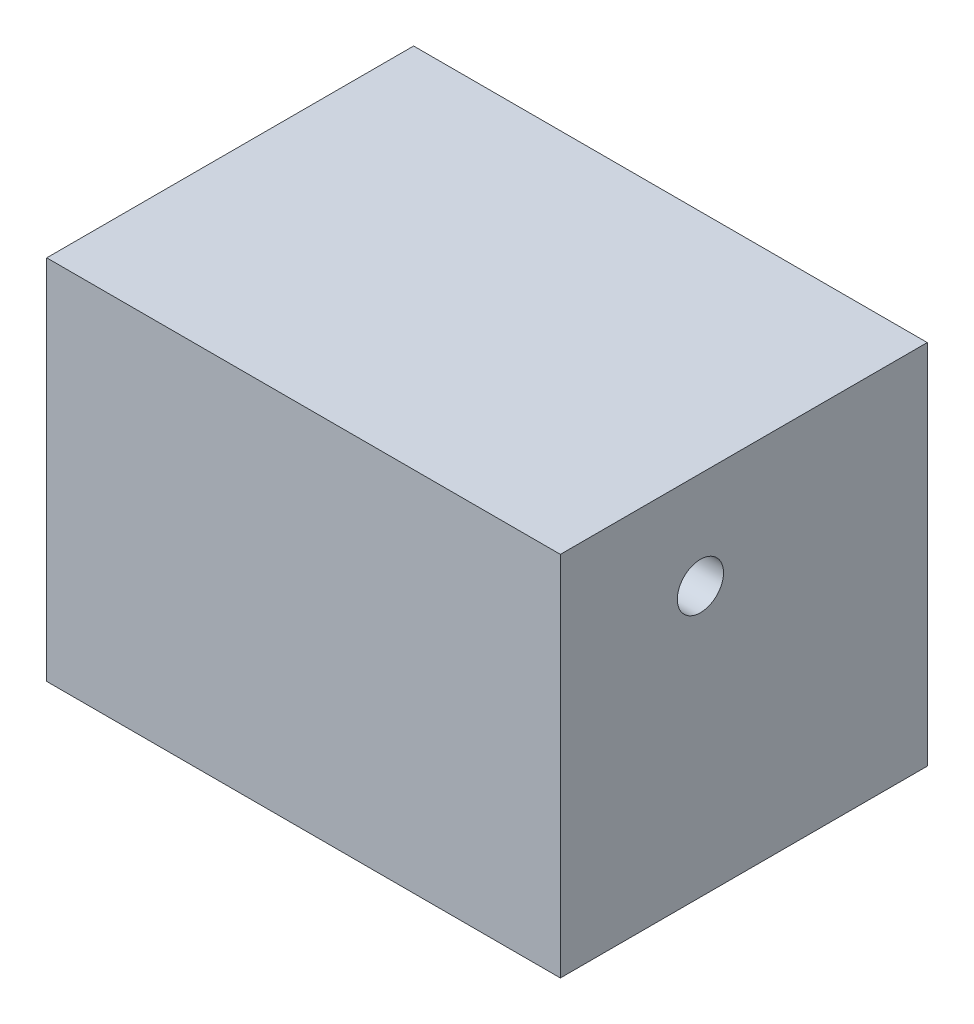
ISO-10303-21;
HEADER;
FILE_DESCRIPTION(('STEP AP214'),'2;1');
FILE_NAME('part.step','',(''),(''),'','','');
FILE_SCHEMA(('AUTOMOTIVE_DESIGN { 1 0 10303 214 1 1 1 1 }'));
ENDSEC;
DATA;
#1=APPLICATION_CONTEXT('core data for automotive mechanical design processes');
#2=APPLICATION_PROTOCOL_DEFINITION('international standard','automotive_design',2000,#1);
#3=PRODUCT_CONTEXT('',#1,'mechanical');
#4=PRODUCT('Part','Part','',(#3));
#5=PRODUCT_RELATED_PRODUCT_CATEGORY('part','',(#4));
#6=PRODUCT_DEFINITION_FORMATION('','',#4);
#7=PRODUCT_DEFINITION_CONTEXT('part definition',#1,'design');
#8=PRODUCT_DEFINITION('design','',#6,#7);
#9=PRODUCT_DEFINITION_SHAPE('','',#8);
#10=(LENGTH_UNIT() NAMED_UNIT(*) SI_UNIT(.MILLI.,.METRE.));
#11=(NAMED_UNIT(*) PLANE_ANGLE_UNIT() SI_UNIT($,.RADIAN.));
#12=(NAMED_UNIT(*) SI_UNIT($,.STERADIAN.) SOLID_ANGLE_UNIT());
#13=UNCERTAINTY_MEASURE_WITH_UNIT(LENGTH_MEASURE(1.E-05),#10,'distance_accuracy_value','');
#14=(GEOMETRIC_REPRESENTATION_CONTEXT(3) GLOBAL_UNCERTAINTY_ASSIGNED_CONTEXT((#13)) GLOBAL_UNIT_ASSIGNED_CONTEXT((#10,
#11,#12)) REPRESENTATION_CONTEXT('',''));
#15=CARTESIAN_POINT('',(0.,0.,0.));
#16=DIRECTION('',(0.,0.,1.));
#17=DIRECTION('',(1.,0.,0.));
#18=AXIS2_PLACEMENT_3D('',#15,#16,#17);
#19=CARTESIAN_POINT('',(22.5916230366492,16.3350785340314,45.));
#20=DIRECTION('',(1.,0.,0.));
#21=DIRECTION('',(0.,1.,0.));
#22=AXIS2_PLACEMENT_3D('',#19,#20,#21);
#23=PLANE('',#22);
#24=CARTESIAN_POINT('',(22.5916230366492,8.05660679893094,30.9132628317386));
#25=DIRECTION('',(1.,0.,0.));
#26=DIRECTION('',(0.,1.,0.));
#27=AXIS2_PLACEMENT_3D('',#24,#25,#26);
#28=CIRCLE('',#27,3.14974379424633);
#29=CARTESIAN_POINT('',(22.5916230366492,11.2063505931773,30.9132628317386));
#30=VERTEX_POINT('',#29);
#31=EDGE_CURVE('E244',#30,#30,#28,.F.);
#32=ORIENTED_EDGE('',*,*,#31,.F.);
#33=EDGE_LOOP('',(#32));
#34=FACE_BOUND('',#33,.T.);
#35=DIRECTION('',(0.,-1.,0.));
#36=VECTOR('',#35,1.);
#37=CARTESIAN_POINT('',(22.5916230366492,16.3350785340314,5.));
#38=LINE('',#37,#36);
#39=CARTESIAN_POINT('',(22.5916230366492,16.3350785340314,5.));
#40=VERTEX_POINT('',#39);
#41=CARTESIAN_POINT('',(22.5916230366492,-23.6649214659686,5.));
#42=VERTEX_POINT('',#41);
#43=EDGE_CURVE('E115',#40,#42,#38,.T.);
#44=ORIENTED_EDGE('',*,*,#43,.T.);
#45=DIRECTION('',(0.,0.,-1.));
#46=VECTOR('',#45,1.);
#47=CARTESIAN_POINT('',(22.5916230366492,-23.6649214659686,45.));
#48=LINE('',#47,#46);
#49=CARTESIAN_POINT('',(22.5916230366492,-23.6649214659686,45.));
#50=VERTEX_POINT('',#49);
#51=EDGE_CURVE('E109',#50,#42,#48,.T.);
#52=ORIENTED_EDGE('',*,*,#51,.F.);
#53=DIRECTION('',(0.,-1.,0.));
#54=VECTOR('',#53,1.);
#55=CARTESIAN_POINT('',(22.5916230366492,16.3350785340314,45.));
#56=LINE('',#55,#54);
#57=CARTESIAN_POINT('',(22.5916230366492,16.3350785340314,45.));
#58=VERTEX_POINT('',#57);
#59=EDGE_CURVE('E112',#58,#50,#56,.T.);
#60=ORIENTED_EDGE('',*,*,#59,.F.);
#61=DIRECTION('',(0.,0.,-1.));
#62=VECTOR('',#61,1.);
#63=CARTESIAN_POINT('',(22.5916230366492,16.3350785340314,45.));
#64=LINE('',#63,#62);
#65=EDGE_CURVE('E148',#58,#40,#64,.T.);
#66=ORIENTED_EDGE('',*,*,#65,.T.);
#67=EDGE_LOOP('',(#44,#52,#60,#66));
#68=FACE_BOUND('',#67,.T.);
#69=ADVANCED_FACE('F34',(#34,#68),#23,.F.);
#70=CARTESIAN_POINT('',(22.5916230366492,16.3350785340314,45.));
#71=DIRECTION('',(0.,1.,0.));
#72=DIRECTION('',(0.,0.,1.));
#73=AXIS2_PLACEMENT_3D('',#70,#71,#72);
#74=PLANE('',#73);
#75=DIRECTION('',(1.,0.,0.));
#76=VECTOR('',#75,1.);
#77=CARTESIAN_POINT('',(22.5916230366492,16.3350785340314,5.));
#78=LINE('',#77,#76);
#79=CARTESIAN_POINT('',(-37.4083769633508,16.3350785340314,5.));
#80=VERTEX_POINT('',#79);
#81=EDGE_CURVE('E132',#80,#40,#78,.T.);
#82=ORIENTED_EDGE('',*,*,#81,.T.);
#83=ORIENTED_EDGE('',*,*,#65,.F.);
#84=DIRECTION('',(1.,0.,0.));
#85=VECTOR('',#84,1.);
#86=CARTESIAN_POINT('',(22.5916230366492,16.3350785340314,45.));
#87=LINE('',#86,#85);
#88=CARTESIAN_POINT('',(-37.4083769633508,16.3350785340314,45.));
#89=VERTEX_POINT('',#88);
#90=EDGE_CURVE('E120',#89,#58,#87,.T.);
#91=ORIENTED_EDGE('',*,*,#90,.F.);
#92=DIRECTION('',(0.,0.,-1.));
#93=VECTOR('',#92,1.);
#94=CARTESIAN_POINT('',(-37.4083769633508,16.3350785340314,45.));
#95=LINE('',#94,#93);
#96=EDGE_CURVE('E151',#89,#80,#95,.T.);
#97=ORIENTED_EDGE('',*,*,#96,.T.);
#98=EDGE_LOOP('',(#82,#83,#91,#97));
#99=FACE_BOUND('',#98,.T.);
#100=ADVANCED_FACE('F191',(#99),#74,.F.);
#101=CARTESIAN_POINT('',(-37.4083769633508,16.3350785340314,45.));
#102=DIRECTION('',(-1.,0.,0.));
#103=DIRECTION('',(0.,0.,1.));
#104=AXIS2_PLACEMENT_3D('',#101,#102,#103);
#105=PLANE('',#104);
#106=CARTESIAN_POINT('',(-37.4083769633508,3.36049207939126,23.9998442415299));
#107=DIRECTION('',(-1.,0.,0.));
#108=DIRECTION('',(0.,0.,1.));
#109=AXIS2_PLACEMENT_3D('',#106,#107,#108);
#110=CIRCLE('',#109,4.14454946721404);
#111=CARTESIAN_POINT('',(-37.4083769633508,3.36049207939126,28.1443937087439));
#112=VERTEX_POINT('',#111);
#113=EDGE_CURVE('E237',#112,#112,#110,.F.);
#114=ORIENTED_EDGE('',*,*,#113,.F.);
#115=EDGE_LOOP('',(#114));
#116=FACE_BOUND('',#115,.T.);
#117=DIRECTION('',(0.,1.,0.));
#118=VECTOR('',#117,1.);
#119=CARTESIAN_POINT('',(-37.4083769633508,16.3350785340314,5.));
#120=LINE('',#119,#118);
#121=CARTESIAN_POINT('',(-37.4083769633508,-23.6649214659686,5.));
#122=VERTEX_POINT('',#121);
#123=EDGE_CURVE('E135',#122,#80,#120,.T.);
#124=ORIENTED_EDGE('',*,*,#123,.T.);
#125=ORIENTED_EDGE('',*,*,#96,.F.);
#126=DIRECTION('',(0.,1.,0.));
#127=VECTOR('',#126,1.);
#128=CARTESIAN_POINT('',(-37.4083769633508,16.3350785340314,45.));
#129=LINE('',#128,#127);
#130=CARTESIAN_POINT('',(-37.4083769633508,-23.6649214659686,45.));
#131=VERTEX_POINT('',#130);
#132=EDGE_CURVE('E128',#131,#89,#129,.T.);
#133=ORIENTED_EDGE('',*,*,#132,.F.);
#134=DIRECTION('',(0.,0.,-1.));
#135=VECTOR('',#134,1.);
#136=CARTESIAN_POINT('',(-37.4083769633508,-23.6649214659686,45.));
#137=LINE('',#136,#135);
#138=EDGE_CURVE('E119',#131,#122,#137,.T.);
#139=ORIENTED_EDGE('',*,*,#138,.T.);
#140=EDGE_LOOP('',(#124,#125,#133,#139));
#141=FACE_BOUND('',#140,.T.);
#142=ADVANCED_FACE('F197',(#116,#141),#105,.F.);
#143=CARTESIAN_POINT('',(22.5916230366492,-23.6649214659686,45.));
#144=DIRECTION('',(0.,-1.,0.));
#145=DIRECTION('',(0.,0.,-1.));
#146=AXIS2_PLACEMENT_3D('',#143,#144,#145);
#147=PLANE('',#146);
#148=CARTESIAN_POINT('',(11.4362836444775,-23.6649214659686,25.2544914611121));
#149=DIRECTION('',(0.,1.,0.));
#150=DIRECTION('',(0.,0.,1.));
#151=AXIS2_PLACEMENT_3D('',#148,#149,#150);
#152=CIRCLE('',#151,3.);
#153=CARTESIAN_POINT('',(11.4362836444775,-23.6649214659686,28.2544914611121));
#154=VERTEX_POINT('',#153);
#155=EDGE_CURVE('E250',#154,#154,#152,.T.);
#156=ORIENTED_EDGE('',*,*,#155,.F.);
#157=EDGE_LOOP('',(#156));
#158=FACE_BOUND('',#157,.T.);
#159=DIRECTION('',(-1.,0.,0.));
#160=VECTOR('',#159,1.);
#161=CARTESIAN_POINT('',(22.5916230366492,-23.6649214659686,5.));
#162=LINE('',#161,#160);
#163=EDGE_CURVE('E144',#42,#122,#162,.T.);
#164=ORIENTED_EDGE('',*,*,#163,.T.);
#165=ORIENTED_EDGE('',*,*,#138,.F.);
#166=DIRECTION('',(-1.,0.,0.));
#167=VECTOR('',#166,1.);
#168=CARTESIAN_POINT('',(22.5916230366492,-23.6649214659686,45.));
#169=LINE('',#168,#167);
#170=EDGE_CURVE('E123',#50,#131,#169,.T.);
#171=ORIENTED_EDGE('',*,*,#170,.F.);
#172=ORIENTED_EDGE('',*,*,#51,.T.);
#173=EDGE_LOOP('',(#164,#165,#171,#172));
#174=FACE_BOUND('',#173,.T.);
#175=ADVANCED_FACE('F124',(#158,#174),#147,.F.);
#176=CARTESIAN_POINT('',(0.,0.,45.));
#177=DIRECTION('',(0.,0.,-1.));
#178=DIRECTION('',(-1.,0.,0.));
#179=AXIS2_PLACEMENT_3D('',#176,#177,#178);
#180=PLANE('',#179);
#181=ORIENTED_EDGE('',*,*,#59,.T.);
#182=ORIENTED_EDGE('',*,*,#170,.T.);
#183=ORIENTED_EDGE('',*,*,#132,.T.);
#184=ORIENTED_EDGE('',*,*,#90,.T.);
#185=EDGE_LOOP('',(#181,#182,#183,#184));
#186=FACE_BOUND('',#185,.T.);
#187=ADVANCED_FACE('F130',(#186),#180,.T.);
#188=CARTESIAN_POINT('',(0.,0.,5.));
#189=DIRECTION('',(0.,0.,-1.));
#190=DIRECTION('',(-1.,0.,0.));
#191=AXIS2_PLACEMENT_3D('',#188,#189,#190);
#192=PLANE('',#191);
#193=ORIENTED_EDGE('',*,*,#43,.F.);
#194=ORIENTED_EDGE('',*,*,#81,.F.);
#195=ORIENTED_EDGE('',*,*,#123,.F.);
#196=ORIENTED_EDGE('',*,*,#163,.F.);
#197=EDGE_LOOP('',(#193,#194,#195,#196));
#198=FACE_BOUND('',#197,.T.);
#199=ADVANCED_FACE('F222',(#198),#192,.F.);
#200=CARTESIAN_POINT('',(11.4362836444775,-28.6659214659686,25.2544914611121));
#201=DIRECTION('',(0.,1.,0.));
#202=DIRECTION('',(0.,0.,1.));
#203=AXIS2_PLACEMENT_3D('',#200,#201,#202);
#204=CYLINDRICAL_SURFACE('',#203,3.);
#205=ORIENTED_EDGE('',*,*,#155,.T.);
#206=EDGE_LOOP('',(#205));
#207=FACE_BOUND('',#206,.T.);
#208=CARTESIAN_POINT('',(11.4362836444775,-28.6649214659686,25.2544914611121));
#209=DIRECTION('',(0.,1.,0.));
#210=DIRECTION('',(0.,0.,1.));
#211=AXIS2_PLACEMENT_3D('',#208,#209,#210);
#212=CIRCLE('',#211,3.);
#213=CARTESIAN_POINT('',(11.4362836444775,-28.6649214659686,28.2544914611121));
#214=VERTEX_POINT('',#213);
#215=EDGE_CURVE('E138',#214,#214,#212,.F.);
#216=ORIENTED_EDGE('',*,*,#215,.T.);
#217=EDGE_LOOP('',(#216));
#218=FACE_BOUND('',#217,.T.);
#219=ADVANCED_FACE('F219',(#207,#218),#204,.F.);
#220=CARTESIAN_POINT('',(-42.4083769633508,21.3350785340314,50.));
#221=DIRECTION('',(1.,0.,0.));
#222=DIRECTION('',(0.,0.,-1.));
#223=AXIS2_PLACEMENT_3D('',#220,#221,#222);
#224=PLANE('',#223);
#225=CARTESIAN_POINT('',(-42.4083769633508,3.36049207939126,23.9998442415299));
#226=DIRECTION('',(-1.,0.,0.));
#227=DIRECTION('',(0.,0.,1.));
#228=AXIS2_PLACEMENT_3D('',#225,#226,#227);
#229=CIRCLE('',#228,4.14454946721404);
#230=CARTESIAN_POINT('',(-42.4083769633508,3.36049207939126,28.1443937087439));
#231=VERTEX_POINT('',#230);
#232=EDGE_CURVE('E242',#231,#231,#229,.T.);
#233=ORIENTED_EDGE('',*,*,#232,.F.);
#234=EDGE_LOOP('',(#233));
#235=FACE_BOUND('',#234,.T.);
#236=DIRECTION('',(0.,-1.,0.));
#237=VECTOR('',#236,1.);
#238=CARTESIAN_POINT('',(-42.4083769633508,21.3350785340314,0.));
#239=LINE('',#238,#237);
#240=CARTESIAN_POINT('',(-42.4083769633508,21.3350785340314,0.));
#241=VERTEX_POINT('',#240);
#242=CARTESIAN_POINT('',(-42.4083769633508,-28.6649214659686,0.));
#243=VERTEX_POINT('',#242);
#244=EDGE_CURVE('E150',#241,#243,#239,.T.);
#245=ORIENTED_EDGE('',*,*,#244,.T.);
#246=DIRECTION('',(0.,0.,-1.));
#247=VECTOR('',#246,1.);
#248=CARTESIAN_POINT('',(-42.4083769633508,-28.6649214659686,50.));
#249=LINE('',#248,#247);
#250=CARTESIAN_POINT('',(-42.4083769633508,-28.6649214659686,50.));
#251=VERTEX_POINT('',#250);
#252=EDGE_CURVE('E11',#251,#243,#249,.T.);
#253=ORIENTED_EDGE('',*,*,#252,.F.);
#254=DIRECTION('',(0.,-1.,0.));
#255=VECTOR('',#254,1.);
#256=CARTESIAN_POINT('',(-42.4083769633508,21.3350785340314,50.));
#257=LINE('',#256,#255);
#258=CARTESIAN_POINT('',(-42.4083769633508,21.3350785340314,50.));
#259=VERTEX_POINT('',#258);
#260=EDGE_CURVE('E154',#259,#251,#257,.T.);
#261=ORIENTED_EDGE('',*,*,#260,.F.);
#262=DIRECTION('',(0.,0.,-1.));
#263=VECTOR('',#262,1.);
#264=CARTESIAN_POINT('',(-42.4083769633508,21.3350785340314,50.));
#265=LINE('',#264,#263);
#266=EDGE_CURVE('E160',#259,#241,#265,.T.);
#267=ORIENTED_EDGE('',*,*,#266,.T.);
#268=EDGE_LOOP('',(#245,#253,#261,#267));
#269=FACE_BOUND('',#268,.T.);
#270=ADVANCED_FACE('F36',(#235,#269),#224,.F.);
#271=CARTESIAN_POINT('',(-42.4083769633508,-28.6649214659686,50.));
#272=DIRECTION('',(0.,1.,0.));
#273=DIRECTION('',(0.,0.,1.));
#274=AXIS2_PLACEMENT_3D('',#271,#272,#273);
#275=PLANE('',#274);
#276=ORIENTED_EDGE('',*,*,#215,.F.);
#277=EDGE_LOOP('',(#276));
#278=FACE_BOUND('',#277,.T.);
#279=DIRECTION('',(1.,0.,0.));
#280=VECTOR('',#279,1.);
#281=CARTESIAN_POINT('',(-42.4083769633508,-28.6649214659686,0.));
#282=LINE('',#281,#280);
#283=CARTESIAN_POINT('',(27.5916230366492,-28.6649214659686,0.));
#284=VERTEX_POINT('',#283);
#285=EDGE_CURVE('E163',#243,#284,#282,.T.);
#286=ORIENTED_EDGE('',*,*,#285,.T.);
#287=DIRECTION('',(0.,0.,-1.));
#288=VECTOR('',#287,1.);
#289=CARTESIAN_POINT('',(27.5916230366492,-28.6649214659686,50.));
#290=LINE('',#289,#288);
#291=CARTESIAN_POINT('',(27.5916230366492,-28.6649214659686,50.));
#292=VERTEX_POINT('',#291);
#293=EDGE_CURVE('E43',#292,#284,#290,.T.);
#294=ORIENTED_EDGE('',*,*,#293,.F.);
#295=DIRECTION('',(1.,0.,0.));
#296=VECTOR('',#295,1.);
#297=CARTESIAN_POINT('',(-42.4083769633508,-28.6649214659686,50.));
#298=LINE('',#297,#296);
#299=EDGE_CURVE('E82',#251,#292,#298,.T.);
#300=ORIENTED_EDGE('',*,*,#299,.F.);
#301=ORIENTED_EDGE('',*,*,#252,.T.);
#302=EDGE_LOOP('',(#286,#294,#300,#301));
#303=FACE_BOUND('',#302,.T.);
#304=ADVANCED_FACE('F186',(#278,#303),#275,.F.);
#305=CARTESIAN_POINT('',(27.5916230366492,21.3350785340314,50.));
#306=DIRECTION('',(-1.,0.,0.));
#307=DIRECTION('',(0.,0.,1.));
#308=AXIS2_PLACEMENT_3D('',#305,#306,#307);
#309=PLANE('',#308);
#310=CARTESIAN_POINT('',(27.5916230366492,8.05660679893094,30.9132628317386));
#311=DIRECTION('',(1.,0.,0.));
#312=DIRECTION('',(0.,0.,-1.));
#313=AXIS2_PLACEMENT_3D('',#310,#311,#312);
#314=CIRCLE('',#313,3.14974379424633);
#315=CARTESIAN_POINT('',(27.5916230366492,8.05660679893094,27.7635190374922));
#316=VERTEX_POINT('',#315);
#317=EDGE_CURVE('E241',#316,#316,#314,.T.);
#318=ORIENTED_EDGE('',*,*,#317,.F.);
#319=EDGE_LOOP('',(#318));
#320=FACE_BOUND('',#319,.T.);
#321=DIRECTION('',(0.,1.,0.));
#322=VECTOR('',#321,1.);
#323=CARTESIAN_POINT('',(27.5916230366492,21.3350785340314,0.));
#324=LINE('',#323,#322);
#325=CARTESIAN_POINT('',(27.5916230366492,21.3350785340314,0.));
#326=VERTEX_POINT('',#325);
#327=EDGE_CURVE('E69',#284,#326,#324,.T.);
#328=ORIENTED_EDGE('',*,*,#327,.T.);
#329=DIRECTION('',(0.,0.,-1.));
#330=VECTOR('',#329,1.);
#331=CARTESIAN_POINT('',(27.5916230366492,21.3350785340314,50.));
#332=LINE('',#331,#330);
#333=CARTESIAN_POINT('',(27.5916230366492,21.3350785340314,50.));
#334=VERTEX_POINT('',#333);
#335=EDGE_CURVE('E168',#334,#326,#332,.T.);
#336=ORIENTED_EDGE('',*,*,#335,.F.);
#337=DIRECTION('',(0.,1.,0.));
#338=VECTOR('',#337,1.);
#339=CARTESIAN_POINT('',(27.5916230366492,21.3350785340314,50.));
#340=LINE('',#339,#338);
#341=EDGE_CURVE('E157',#292,#334,#340,.T.);
#342=ORIENTED_EDGE('',*,*,#341,.F.);
#343=ORIENTED_EDGE('',*,*,#293,.T.);
#344=EDGE_LOOP('',(#328,#336,#342,#343));
#345=FACE_BOUND('',#344,.T.);
#346=ADVANCED_FACE('F170',(#320,#345),#309,.F.);
#347=CARTESIAN_POINT('',(-42.4083769633508,21.3350785340314,50.));
#348=DIRECTION('',(0.,-1.,0.));
#349=DIRECTION('',(1.,0.,0.));
#350=AXIS2_PLACEMENT_3D('',#347,#348,#349);
#351=PLANE('',#350);
#352=DIRECTION('',(-1.,0.,0.));
#353=VECTOR('',#352,1.);
#354=CARTESIAN_POINT('',(-42.4083769633508,21.3350785340314,0.));
#355=LINE('',#354,#353);
#356=EDGE_CURVE('E75',#326,#241,#355,.T.);
#357=ORIENTED_EDGE('',*,*,#356,.T.);
#358=ORIENTED_EDGE('',*,*,#266,.F.);
#359=DIRECTION('',(-1.,0.,0.));
#360=VECTOR('',#359,1.);
#361=CARTESIAN_POINT('',(-42.4083769633508,21.3350785340314,50.));
#362=LINE('',#361,#360);
#363=EDGE_CURVE('E51',#334,#259,#362,.T.);
#364=ORIENTED_EDGE('',*,*,#363,.F.);
#365=ORIENTED_EDGE('',*,*,#335,.T.);
#366=EDGE_LOOP('',(#357,#358,#364,#365));
#367=FACE_BOUND('',#366,.T.);
#368=ADVANCED_FACE('F177',(#367),#351,.F.);
#369=CARTESIAN_POINT('',(0.,0.,50.));
#370=DIRECTION('',(0.,0.,1.));
#371=DIRECTION('',(1.,0.,0.));
#372=AXIS2_PLACEMENT_3D('',#369,#370,#371);
#373=PLANE('',#372);
#374=ORIENTED_EDGE('',*,*,#260,.T.);
#375=ORIENTED_EDGE('',*,*,#299,.T.);
#376=ORIENTED_EDGE('',*,*,#341,.T.);
#377=ORIENTED_EDGE('',*,*,#363,.T.);
#378=EDGE_LOOP('',(#374,#375,#376,#377));
#379=FACE_BOUND('',#378,.T.);
#380=ADVANCED_FACE('F179',(#379),#373,.T.);
#381=CARTESIAN_POINT('',(0.,0.,0.));
#382=DIRECTION('',(0.,0.,1.));
#383=DIRECTION('',(1.,0.,0.));
#384=AXIS2_PLACEMENT_3D('',#381,#382,#383);
#385=PLANE('',#384);
#386=ORIENTED_EDGE('',*,*,#244,.F.);
#387=ORIENTED_EDGE('',*,*,#356,.F.);
#388=ORIENTED_EDGE('',*,*,#327,.F.);
#389=ORIENTED_EDGE('',*,*,#285,.F.);
#390=EDGE_LOOP('',(#386,#387,#388,#389));
#391=FACE_BOUND('',#390,.T.);
#392=ADVANCED_FACE('F173',(#391),#385,.F.);
#393=CARTESIAN_POINT('',(-42.4093769633508,8.05660679893094,30.9132628317386));
#394=DIRECTION('',(1.,0.,0.));
#395=DIRECTION('',(0.,0.,-1.));
#396=AXIS2_PLACEMENT_3D('',#393,#394,#395);
#397=CYLINDRICAL_SURFACE('',#396,3.14974379424633);
#398=ORIENTED_EDGE('',*,*,#317,.T.);
#399=EDGE_LOOP('',(#398));
#400=FACE_BOUND('',#399,.T.);
#401=ORIENTED_EDGE('',*,*,#31,.T.);
#402=EDGE_LOOP('',(#401));
#403=FACE_BOUND('',#402,.T.);
#404=ADVANCED_FACE('F204',(#400,#403),#397,.F.);
#405=CARTESIAN_POINT('',(27.5926230366492,3.36049207939126,23.9998442415299));
#406=DIRECTION('',(-1.,0.,0.));
#407=DIRECTION('',(0.,0.,1.));
#408=AXIS2_PLACEMENT_3D('',#405,#406,#407);
#409=CYLINDRICAL_SURFACE('',#408,4.14454946721404);
#410=ORIENTED_EDGE('',*,*,#232,.T.);
#411=EDGE_LOOP('',(#410));
#412=FACE_BOUND('',#411,.T.);
#413=ORIENTED_EDGE('',*,*,#113,.T.);
#414=EDGE_LOOP('',(#413));
#415=FACE_BOUND('',#414,.T.);
#416=ADVANCED_FACE('F208',(#412,#415),#409,.F.);
#417=CLOSED_SHELL('',(#69,#100,#142,#175,#187,#199,#219,#270,#304,#346,#368,#380,#392,#404,#416));
#418=MANIFOLD_SOLID_BREP('B2',#417);
#419=ADVANCED_BREP_SHAPE_REPRESENTATION('',(#18,#418),#14);
#420=SHAPE_DEFINITION_REPRESENTATION(#9,#419);
ENDSEC;
END-ISO-10303-21;
